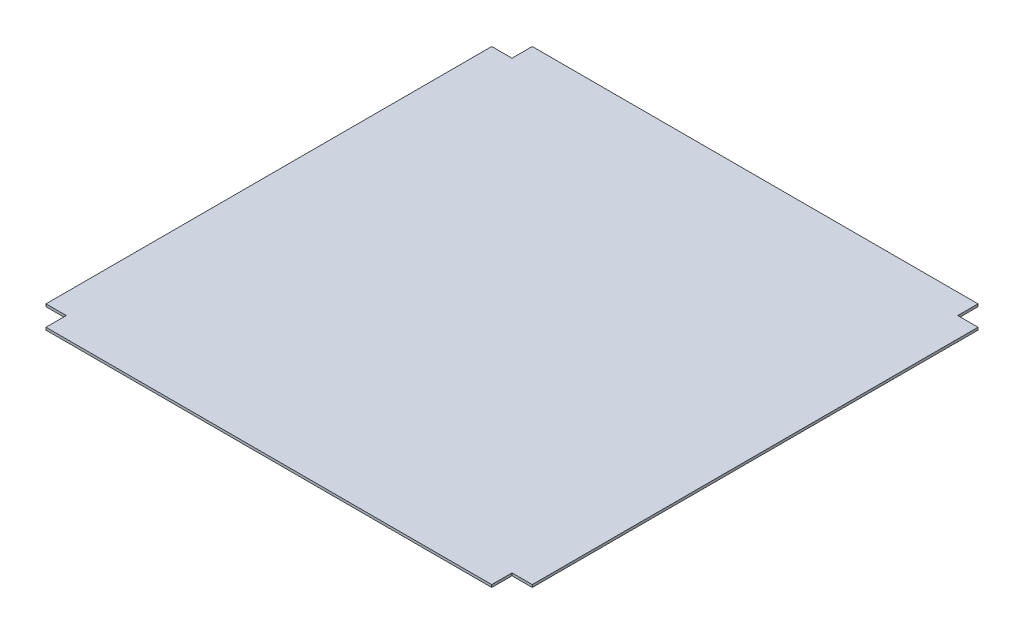
ISO-10303-21;
HEADER;
FILE_DESCRIPTION(('STEP AP214'),'2;1');
FILE_NAME('part.step','',(''),(''),'','','');
FILE_SCHEMA(('AUTOMOTIVE_DESIGN { 1 0 10303 214 1 1 1 1 }'));
ENDSEC;
DATA;
#1=APPLICATION_CONTEXT('core data for automotive mechanical design processes');
#2=APPLICATION_PROTOCOL_DEFINITION('international standard','automotive_design',2000,#1);
#3=PRODUCT_CONTEXT('',#1,'mechanical');
#4=PRODUCT('Part','Part','',(#3));
#5=PRODUCT_RELATED_PRODUCT_CATEGORY('part','',(#4));
#6=PRODUCT_DEFINITION_FORMATION('','',#4);
#7=PRODUCT_DEFINITION_CONTEXT('part definition',#1,'design');
#8=PRODUCT_DEFINITION('design','',#6,#7);
#9=PRODUCT_DEFINITION_SHAPE('','',#8);
#10=(LENGTH_UNIT() NAMED_UNIT(*) SI_UNIT(.MILLI.,.METRE.));
#11=(NAMED_UNIT(*) PLANE_ANGLE_UNIT() SI_UNIT($,.RADIAN.));
#12=(NAMED_UNIT(*) SI_UNIT($,.STERADIAN.) SOLID_ANGLE_UNIT());
#13=UNCERTAINTY_MEASURE_WITH_UNIT(LENGTH_MEASURE(1.E-05),#10,'distance_accuracy_value','');
#14=(GEOMETRIC_REPRESENTATION_CONTEXT(3) GLOBAL_UNCERTAINTY_ASSIGNED_CONTEXT((#13)) GLOBAL_UNIT_ASSIGNED_CONTEXT((#10,
#11,#12)) REPRESENTATION_CONTEXT('',''));
#15=CARTESIAN_POINT('',(0.,0.,0.));
#16=DIRECTION('',(0.,0.,1.));
#17=DIRECTION('',(1.,0.,0.));
#18=AXIS2_PLACEMENT_3D('',#15,#16,#17);
#19=CARTESIAN_POINT('',(609.6,3.175,609.6));
#20=DIRECTION('',(-1.,0.,0.));
#21=DIRECTION('',(0.,0.,1.));
#22=AXIS2_PLACEMENT_3D('',#19,#20,#21);
#23=PLANE('',#22);
#24=DIRECTION('',(0.,0.,-1.));
#25=VECTOR('',#24,1.);
#26=CARTESIAN_POINT('',(609.6,3.175,609.6));
#27=LINE('',#26,#25);
#28=CARTESIAN_POINT('',(609.600000000001,3.175,558.8));
#29=VERTEX_POINT('',#28);
#30=CARTESIAN_POINT('',(609.6,3.175,-558.8));
#31=VERTEX_POINT('',#30);
#32=EDGE_CURVE('E154',#29,#31,#27,.T.);
#33=ORIENTED_EDGE('',*,*,#32,.F.);
#34=DIRECTION('',(0.,1.,0.));
#35=VECTOR('',#34,1.);
#36=CARTESIAN_POINT('',(609.600000000001,-3.175,558.8));
#37=LINE('',#36,#35);
#38=CARTESIAN_POINT('',(609.600000000001,-3.175,558.8));
#39=VERTEX_POINT('',#38);
#40=EDGE_CURVE('E236',#39,#29,#37,.T.);
#41=ORIENTED_EDGE('',*,*,#40,.F.);
#42=DIRECTION('',(0.,0.,-1.));
#43=VECTOR('',#42,1.);
#44=CARTESIAN_POINT('',(609.6,-3.175,609.6));
#45=LINE('',#44,#43);
#46=CARTESIAN_POINT('',(609.6,-3.175,-558.8));
#47=VERTEX_POINT('',#46);
#48=EDGE_CURVE('E156',#39,#47,#45,.T.);
#49=ORIENTED_EDGE('',*,*,#48,.T.);
#50=DIRECTION('',(0.,1.,0.));
#51=VECTOR('',#50,1.);
#52=CARTESIAN_POINT('',(609.6,-3.175,-558.8));
#53=LINE('',#52,#51);
#54=EDGE_CURVE('E139',#47,#31,#53,.T.);
#55=ORIENTED_EDGE('',*,*,#54,.T.);
#56=EDGE_LOOP('',(#33,#41,#49,#55));
#57=FACE_BOUND('',#56,.T.);
#58=ADVANCED_FACE('F47',(#57),#23,.F.);
#59=CARTESIAN_POINT('',(-609.6,3.175,-609.6));
#60=DIRECTION('',(0.,0.,1.));
#61=DIRECTION('',(1.,0.,0.));
#62=AXIS2_PLACEMENT_3D('',#59,#60,#61);
#63=PLANE('',#62);
#64=DIRECTION('',(-1.,0.,0.));
#65=VECTOR('',#64,1.);
#66=CARTESIAN_POINT('',(-609.6,3.175,-609.6));
#67=LINE('',#66,#65);
#68=CARTESIAN_POINT('',(558.800000000001,3.175,-609.6));
#69=VERTEX_POINT('',#68);
#70=CARTESIAN_POINT('',(-558.800000000001,3.175,-609.6));
#71=VERTEX_POINT('',#70);
#72=EDGE_CURVE('E164',#69,#71,#67,.T.);
#73=ORIENTED_EDGE('',*,*,#72,.F.);
#74=DIRECTION('',(0.,1.,0.));
#75=VECTOR('',#74,1.);
#76=CARTESIAN_POINT('',(558.800000000001,-3.175,-609.6));
#77=LINE('',#76,#75);
#78=CARTESIAN_POINT('',(558.800000000001,-3.175,-609.6));
#79=VERTEX_POINT('',#78);
#80=EDGE_CURVE('E228',#79,#69,#77,.T.);
#81=ORIENTED_EDGE('',*,*,#80,.F.);
#82=DIRECTION('',(-1.,0.,0.));
#83=VECTOR('',#82,1.);
#84=CARTESIAN_POINT('',(-609.6,-3.175,-609.6));
#85=LINE('',#84,#83);
#86=CARTESIAN_POINT('',(-558.800000000001,-3.175,-609.6));
#87=VERTEX_POINT('',#86);
#88=EDGE_CURVE('E176',#79,#87,#85,.T.);
#89=ORIENTED_EDGE('',*,*,#88,.T.);
#90=DIRECTION('',(0.,1.,0.));
#91=VECTOR('',#90,1.);
#92=CARTESIAN_POINT('',(-558.800000000001,-3.175,-609.6));
#93=LINE('',#92,#91);
#94=EDGE_CURVE('E177',#87,#71,#93,.T.);
#95=ORIENTED_EDGE('',*,*,#94,.T.);
#96=EDGE_LOOP('',(#73,#81,#89,#95));
#97=FACE_BOUND('',#96,.T.);
#98=ADVANCED_FACE('F225',(#97),#63,.F.);
#99=CARTESIAN_POINT('',(-609.6,3.175,609.6));
#100=DIRECTION('',(1.,0.,0.));
#101=DIRECTION('',(0.,0.,-1.));
#102=AXIS2_PLACEMENT_3D('',#99,#100,#101);
#103=PLANE('',#102);
#104=DIRECTION('',(0.,0.,1.));
#105=VECTOR('',#104,1.);
#106=CARTESIAN_POINT('',(-609.6,-3.175,609.6));
#107=LINE('',#106,#105);
#108=CARTESIAN_POINT('',(-609.6,-3.175,-558.8));
#109=VERTEX_POINT('',#108);
#110=CARTESIAN_POINT('',(-609.6,-3.175,558.8));
#111=VERTEX_POINT('',#110);
#112=EDGE_CURVE('E169',#109,#111,#107,.T.);
#113=ORIENTED_EDGE('',*,*,#112,.T.);
#114=DIRECTION('',(0.,1.,0.));
#115=VECTOR('',#114,1.);
#116=CARTESIAN_POINT('',(-609.6,-3.175,558.8));
#117=LINE('',#116,#115);
#118=CARTESIAN_POINT('',(-609.6,3.175,558.8));
#119=VERTEX_POINT('',#118);
#120=EDGE_CURVE('E186',#111,#119,#117,.T.);
#121=ORIENTED_EDGE('',*,*,#120,.T.);
#122=DIRECTION('',(0.,0.,1.));
#123=VECTOR('',#122,1.);
#124=CARTESIAN_POINT('',(-609.6,3.175,609.6));
#125=LINE('',#124,#123);
#126=CARTESIAN_POINT('',(-609.6,3.175,-558.8));
#127=VERTEX_POINT('',#126);
#128=EDGE_CURVE('E55',#127,#119,#125,.T.);
#129=ORIENTED_EDGE('',*,*,#128,.F.);
#130=DIRECTION('',(0.,1.,0.));
#131=VECTOR('',#130,1.);
#132=CARTESIAN_POINT('',(-609.6,-3.175,-558.8));
#133=LINE('',#132,#131);
#134=EDGE_CURVE('E171',#109,#127,#133,.T.);
#135=ORIENTED_EDGE('',*,*,#134,.F.);
#136=EDGE_LOOP('',(#113,#121,#129,#135));
#137=FACE_BOUND('',#136,.T.);
#138=ADVANCED_FACE('F184',(#137),#103,.F.);
#139=CARTESIAN_POINT('',(-609.6,3.175,609.6));
#140=DIRECTION('',(0.,0.,-1.));
#141=DIRECTION('',(-1.,0.,0.));
#142=AXIS2_PLACEMENT_3D('',#139,#140,#141);
#143=PLANE('',#142);
#144=DIRECTION('',(1.,0.,0.));
#145=VECTOR('',#144,1.);
#146=CARTESIAN_POINT('',(-609.6,3.175,609.6));
#147=LINE('',#146,#145);
#148=CARTESIAN_POINT('',(-558.8,3.175,609.6));
#149=VERTEX_POINT('',#148);
#150=CARTESIAN_POINT('',(558.800000000001,3.175,609.6));
#151=VERTEX_POINT('',#150);
#152=EDGE_CURVE('E11',#149,#151,#147,.T.);
#153=ORIENTED_EDGE('',*,*,#152,.F.);
#154=DIRECTION('',(0.,1.,0.));
#155=VECTOR('',#154,1.);
#156=CARTESIAN_POINT('',(-558.8,-3.175,609.6));
#157=LINE('',#156,#155);
#158=CARTESIAN_POINT('',(-558.8,-3.175,609.6));
#159=VERTEX_POINT('',#158);
#160=EDGE_CURVE('E195',#159,#149,#157,.T.);
#161=ORIENTED_EDGE('',*,*,#160,.F.);
#162=DIRECTION('',(1.,0.,0.));
#163=VECTOR('',#162,1.);
#164=CARTESIAN_POINT('',(-609.6,-3.175,609.6));
#165=LINE('',#164,#163);
#166=CARTESIAN_POINT('',(558.800000000001,-3.175,609.6));
#167=VERTEX_POINT('',#166);
#168=EDGE_CURVE('E50',#159,#167,#165,.T.);
#169=ORIENTED_EDGE('',*,*,#168,.T.);
#170=DIRECTION('',(0.,1.,0.));
#171=VECTOR('',#170,1.);
#172=CARTESIAN_POINT('',(558.800000000001,-3.175,609.6));
#173=LINE('',#172,#171);
#174=EDGE_CURVE('E240',#167,#151,#173,.T.);
#175=ORIENTED_EDGE('',*,*,#174,.T.);
#176=EDGE_LOOP('',(#153,#161,#169,#175));
#177=FACE_BOUND('',#176,.T.);
#178=ADVANCED_FACE('F258',(#177),#143,.F.);
#179=CARTESIAN_POINT('',(0.,3.175,0.));
#180=DIRECTION('',(0.,-1.,0.));
#181=DIRECTION('',(0.,0.,-1.));
#182=AXIS2_PLACEMENT_3D('',#179,#180,#181);
#183=PLANE('',#182);
#184=ORIENTED_EDGE('',*,*,#128,.T.);
#185=DIRECTION('',(-1.,0.,0.));
#186=VECTOR('',#185,1.);
#187=CARTESIAN_POINT('',(-609.6,3.175,558.8));
#188=LINE('',#187,#186);
#189=CARTESIAN_POINT('',(-558.8,3.175,558.8));
#190=VERTEX_POINT('',#189);
#191=EDGE_CURVE('E197',#190,#119,#188,.T.);
#192=ORIENTED_EDGE('',*,*,#191,.F.);
#193=DIRECTION('',(0.,0.,-1.));
#194=VECTOR('',#193,1.);
#195=CARTESIAN_POINT('',(-558.8,3.175,609.6));
#196=LINE('',#195,#194);
#197=EDGE_CURVE('E202',#149,#190,#196,.T.);
#198=ORIENTED_EDGE('',*,*,#197,.F.);
#199=ORIENTED_EDGE('',*,*,#152,.T.);
#200=DIRECTION('',(0.,0.,1.));
#201=VECTOR('',#200,1.);
#202=CARTESIAN_POINT('',(558.800000000001,3.175,609.6));
#203=LINE('',#202,#201);
#204=CARTESIAN_POINT('',(558.800000000001,3.175,558.8));
#205=VERTEX_POINT('',#204);
#206=EDGE_CURVE('E243',#205,#151,#203,.T.);
#207=ORIENTED_EDGE('',*,*,#206,.F.);
#208=DIRECTION('',(-1.,0.,0.));
#209=VECTOR('',#208,1.);
#210=CARTESIAN_POINT('',(609.600000000001,3.175,558.8));
#211=LINE('',#210,#209);
#212=EDGE_CURVE('E157',#29,#205,#211,.T.);
#213=ORIENTED_EDGE('',*,*,#212,.F.);
#214=ORIENTED_EDGE('',*,*,#32,.T.);
#215=DIRECTION('',(1.,0.,0.));
#216=VECTOR('',#215,1.);
#217=CARTESIAN_POINT('',(609.6,3.175,-558.8));
#218=LINE('',#217,#216);
#219=CARTESIAN_POINT('',(558.800000000001,3.175,-558.8));
#220=VERTEX_POINT('',#219);
#221=EDGE_CURVE('E136',#220,#31,#218,.T.);
#222=ORIENTED_EDGE('',*,*,#221,.F.);
#223=DIRECTION('',(0.,0.,1.));
#224=VECTOR('',#223,1.);
#225=CARTESIAN_POINT('',(558.800000000001,3.175,-609.6));
#226=LINE('',#225,#224);
#227=EDGE_CURVE('E147',#69,#220,#226,.T.);
#228=ORIENTED_EDGE('',*,*,#227,.F.);
#229=ORIENTED_EDGE('',*,*,#72,.T.);
#230=DIRECTION('',(0.,0.,-1.));
#231=VECTOR('',#230,1.);
#232=CARTESIAN_POINT('',(-558.800000000001,3.175,-609.6));
#233=LINE('',#232,#231);
#234=CARTESIAN_POINT('',(-558.800000000001,3.175,-558.8));
#235=VERTEX_POINT('',#234);
#236=EDGE_CURVE('E207',#235,#71,#233,.T.);
#237=ORIENTED_EDGE('',*,*,#236,.F.);
#238=DIRECTION('',(1.,0.,0.));
#239=VECTOR('',#238,1.);
#240=CARTESIAN_POINT('',(-609.6,3.175,-558.8));
#241=LINE('',#240,#239);
#242=EDGE_CURVE('E209',#127,#235,#241,.T.);
#243=ORIENTED_EDGE('',*,*,#242,.F.);
#244=EDGE_LOOP('',(#184,#192,#198,#199,#207,#213,#214,#222,#228,#229,#237,#243));
#245=FACE_BOUND('',#244,.T.);
#246=ADVANCED_FACE('F161',(#245),#183,.F.);
#247=CARTESIAN_POINT('',(0.,-3.175,0.));
#248=DIRECTION('',(0.,-1.,0.));
#249=DIRECTION('',(0.,0.,-1.));
#250=AXIS2_PLACEMENT_3D('',#247,#248,#249);
#251=PLANE('',#250);
#252=DIRECTION('',(-1.,0.,0.));
#253=VECTOR('',#252,1.);
#254=CARTESIAN_POINT('',(-609.6,-3.175,558.8));
#255=LINE('',#254,#253);
#256=CARTESIAN_POINT('',(-558.8,-3.175,558.8));
#257=VERTEX_POINT('',#256);
#258=EDGE_CURVE('E63',#257,#111,#255,.T.);
#259=ORIENTED_EDGE('',*,*,#258,.T.);
#260=ORIENTED_EDGE('',*,*,#112,.F.);
#261=DIRECTION('',(1.,0.,0.));
#262=VECTOR('',#261,1.);
#263=CARTESIAN_POINT('',(-609.6,-3.175,-558.8));
#264=LINE('',#263,#262);
#265=CARTESIAN_POINT('',(-558.800000000001,-3.175,-558.8));
#266=VERTEX_POINT('',#265);
#267=EDGE_CURVE('E191',#109,#266,#264,.T.);
#268=ORIENTED_EDGE('',*,*,#267,.T.);
#269=DIRECTION('',(0.,0.,-1.));
#270=VECTOR('',#269,1.);
#271=CARTESIAN_POINT('',(-558.800000000001,-3.175,-609.6));
#272=LINE('',#271,#270);
#273=EDGE_CURVE('E206',#266,#87,#272,.T.);
#274=ORIENTED_EDGE('',*,*,#273,.T.);
#275=ORIENTED_EDGE('',*,*,#88,.F.);
#276=DIRECTION('',(0.,0.,1.));
#277=VECTOR('',#276,1.);
#278=CARTESIAN_POINT('',(558.800000000001,-3.175,-609.6));
#279=LINE('',#278,#277);
#280=CARTESIAN_POINT('',(558.800000000001,-3.175,-558.8));
#281=VERTEX_POINT('',#280);
#282=EDGE_CURVE('E148',#79,#281,#279,.T.);
#283=ORIENTED_EDGE('',*,*,#282,.T.);
#284=DIRECTION('',(1.,0.,0.));
#285=VECTOR('',#284,1.);
#286=CARTESIAN_POINT('',(609.6,-3.175,-558.8));
#287=LINE('',#286,#285);
#288=EDGE_CURVE('E230',#281,#47,#287,.T.);
#289=ORIENTED_EDGE('',*,*,#288,.T.);
#290=ORIENTED_EDGE('',*,*,#48,.F.);
#291=DIRECTION('',(-1.,0.,0.));
#292=VECTOR('',#291,1.);
#293=CARTESIAN_POINT('',(609.600000000001,-3.175,558.8));
#294=LINE('',#293,#292);
#295=CARTESIAN_POINT('',(558.800000000001,-3.175,558.8));
#296=VERTEX_POINT('',#295);
#297=EDGE_CURVE('E245',#39,#296,#294,.T.);
#298=ORIENTED_EDGE('',*,*,#297,.T.);
#299=DIRECTION('',(0.,0.,1.));
#300=VECTOR('',#299,1.);
#301=CARTESIAN_POINT('',(558.800000000001,-3.175,609.6));
#302=LINE('',#301,#300);
#303=EDGE_CURVE('E71',#296,#167,#302,.T.);
#304=ORIENTED_EDGE('',*,*,#303,.T.);
#305=ORIENTED_EDGE('',*,*,#168,.F.);
#306=DIRECTION('',(0.,0.,-1.));
#307=VECTOR('',#306,1.);
#308=CARTESIAN_POINT('',(-558.8,-3.175,609.6));
#309=LINE('',#308,#307);
#310=EDGE_CURVE('E194',#159,#257,#309,.T.);
#311=ORIENTED_EDGE('',*,*,#310,.T.);
#312=EDGE_LOOP('',(#259,#260,#268,#274,#275,#283,#289,#290,#298,#304,#305,#311));
#313=FACE_BOUND('',#312,.T.);
#314=ADVANCED_FACE('F189',(#313),#251,.T.);
#315=CARTESIAN_POINT('',(-558.800000000001,-3.175,-609.6));
#316=DIRECTION('',(1.,0.,0.));
#317=DIRECTION('',(0.,0.,-1.));
#318=AXIS2_PLACEMENT_3D('',#315,#316,#317);
#319=PLANE('',#318);
#320=ORIENTED_EDGE('',*,*,#236,.T.);
#321=ORIENTED_EDGE('',*,*,#94,.F.);
#322=ORIENTED_EDGE('',*,*,#273,.F.);
#323=DIRECTION('',(0.,1.,0.));
#324=VECTOR('',#323,1.);
#325=CARTESIAN_POINT('',(-558.800000000001,-3.175,-558.8));
#326=LINE('',#325,#324);
#327=EDGE_CURVE('E214',#266,#235,#326,.T.);
#328=ORIENTED_EDGE('',*,*,#327,.T.);
#329=EDGE_LOOP('',(#320,#321,#322,#328));
#330=FACE_BOUND('',#329,.T.);
#331=ADVANCED_FACE('F223',(#330),#319,.F.);
#332=CARTESIAN_POINT('',(-609.6,-3.175,-558.8));
#333=DIRECTION('',(0.,0.,1.));
#334=DIRECTION('',(1.,0.,0.));
#335=AXIS2_PLACEMENT_3D('',#332,#333,#334);
#336=PLANE('',#335);
#337=ORIENTED_EDGE('',*,*,#242,.T.);
#338=ORIENTED_EDGE('',*,*,#327,.F.);
#339=ORIENTED_EDGE('',*,*,#267,.F.);
#340=ORIENTED_EDGE('',*,*,#134,.T.);
#341=EDGE_LOOP('',(#337,#338,#339,#340));
#342=FACE_BOUND('',#341,.T.);
#343=ADVANCED_FACE('F219',(#342),#336,.F.);
#344=CARTESIAN_POINT('',(609.6,-3.175,-558.8));
#345=DIRECTION('',(0.,0.,1.));
#346=DIRECTION('',(1.,0.,0.));
#347=AXIS2_PLACEMENT_3D('',#344,#345,#346);
#348=PLANE('',#347);
#349=ORIENTED_EDGE('',*,*,#221,.T.);
#350=ORIENTED_EDGE('',*,*,#54,.F.);
#351=ORIENTED_EDGE('',*,*,#288,.F.);
#352=DIRECTION('',(0.,1.,0.));
#353=VECTOR('',#352,1.);
#354=CARTESIAN_POINT('',(558.800000000001,-3.175,-558.8));
#355=LINE('',#354,#353);
#356=EDGE_CURVE('E142',#281,#220,#355,.T.);
#357=ORIENTED_EDGE('',*,*,#356,.T.);
#358=EDGE_LOOP('',(#349,#350,#351,#357));
#359=FACE_BOUND('',#358,.T.);
#360=ADVANCED_FACE('F138',(#359),#348,.F.);
#361=CARTESIAN_POINT('',(558.800000000001,-3.175,-609.6));
#362=DIRECTION('',(-1.,0.,0.));
#363=DIRECTION('',(0.,0.,1.));
#364=AXIS2_PLACEMENT_3D('',#361,#362,#363);
#365=PLANE('',#364);
#366=ORIENTED_EDGE('',*,*,#227,.T.);
#367=ORIENTED_EDGE('',*,*,#356,.F.);
#368=ORIENTED_EDGE('',*,*,#282,.F.);
#369=ORIENTED_EDGE('',*,*,#80,.T.);
#370=EDGE_LOOP('',(#366,#367,#368,#369));
#371=FACE_BOUND('',#370,.T.);
#372=ADVANCED_FACE('F270',(#371),#365,.F.);
#373=CARTESIAN_POINT('',(558.800000000001,-3.175,609.6));
#374=DIRECTION('',(-1.,0.,0.));
#375=DIRECTION('',(0.,0.,1.));
#376=AXIS2_PLACEMENT_3D('',#373,#374,#375);
#377=PLANE('',#376);
#378=ORIENTED_EDGE('',*,*,#206,.T.);
#379=ORIENTED_EDGE('',*,*,#174,.F.);
#380=ORIENTED_EDGE('',*,*,#303,.F.);
#381=DIRECTION('',(0.,1.,0.));
#382=VECTOR('',#381,1.);
#383=CARTESIAN_POINT('',(558.800000000001,-3.175,558.8));
#384=LINE('',#383,#382);
#385=EDGE_CURVE('E238',#296,#205,#384,.T.);
#386=ORIENTED_EDGE('',*,*,#385,.T.);
#387=EDGE_LOOP('',(#378,#379,#380,#386));
#388=FACE_BOUND('',#387,.T.);
#389=ADVANCED_FACE('F259',(#388),#377,.F.);
#390=CARTESIAN_POINT('',(609.600000000001,-3.175,558.8));
#391=DIRECTION('',(0.,0.,-1.));
#392=DIRECTION('',(-1.,0.,0.));
#393=AXIS2_PLACEMENT_3D('',#390,#391,#392);
#394=PLANE('',#393);
#395=ORIENTED_EDGE('',*,*,#212,.T.);
#396=ORIENTED_EDGE('',*,*,#385,.F.);
#397=ORIENTED_EDGE('',*,*,#297,.F.);
#398=ORIENTED_EDGE('',*,*,#40,.T.);
#399=EDGE_LOOP('',(#395,#396,#397,#398));
#400=FACE_BOUND('',#399,.T.);
#401=ADVANCED_FACE('F261',(#400),#394,.F.);
#402=CARTESIAN_POINT('',(-609.6,-3.175,558.8));
#403=DIRECTION('',(0.,0.,-1.));
#404=DIRECTION('',(-1.,0.,0.));
#405=AXIS2_PLACEMENT_3D('',#402,#403,#404);
#406=PLANE('',#405);
#407=ORIENTED_EDGE('',*,*,#191,.T.);
#408=ORIENTED_EDGE('',*,*,#120,.F.);
#409=ORIENTED_EDGE('',*,*,#258,.F.);
#410=DIRECTION('',(0.,1.,0.));
#411=VECTOR('',#410,1.);
#412=CARTESIAN_POINT('',(-558.8,-3.175,558.8));
#413=LINE('',#412,#411);
#414=EDGE_CURVE('E199',#257,#190,#413,.T.);
#415=ORIENTED_EDGE('',*,*,#414,.T.);
#416=EDGE_LOOP('',(#407,#408,#409,#415));
#417=FACE_BOUND('',#416,.T.);
#418=ADVANCED_FACE('F263',(#417),#406,.F.);
#419=CARTESIAN_POINT('',(-558.8,-3.175,609.6));
#420=DIRECTION('',(1.,0.,0.));
#421=DIRECTION('',(0.,0.,-1.));
#422=AXIS2_PLACEMENT_3D('',#419,#420,#421);
#423=PLANE('',#422);
#424=ORIENTED_EDGE('',*,*,#197,.T.);
#425=ORIENTED_EDGE('',*,*,#414,.F.);
#426=ORIENTED_EDGE('',*,*,#310,.F.);
#427=ORIENTED_EDGE('',*,*,#160,.T.);
#428=EDGE_LOOP('',(#424,#425,#426,#427));
#429=FACE_BOUND('',#428,.T.);
#430=ADVANCED_FACE('F254',(#429),#423,.F.);
#431=CLOSED_SHELL('',(#58,#98,#138,#178,#246,#314,#331,#343,#360,#372,#389,#401,#418,#430));
#432=MANIFOLD_SOLID_BREP('B2',#431);
#433=ADVANCED_BREP_SHAPE_REPRESENTATION('',(#18,#432),#14);
#434=SHAPE_DEFINITION_REPRESENTATION(#9,#433);
ENDSEC;
END-ISO-10303-21;
